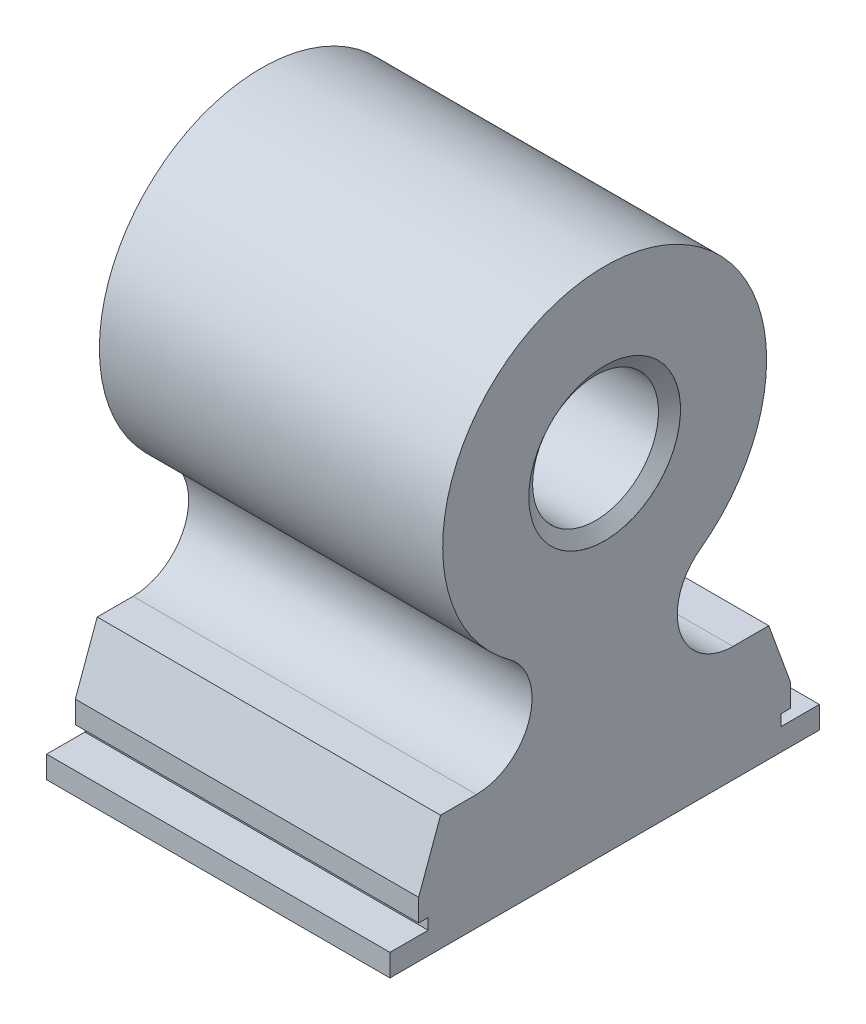
ISO-10303-21;
HEADER;
FILE_DESCRIPTION(('STEP AP214'),'2;1');
FILE_NAME('part.step','',(''),(''),'','','');
FILE_SCHEMA(('AUTOMOTIVE_DESIGN { 1 0 10303 214 1 1 1 1 }'));
ENDSEC;
DATA;
#1=APPLICATION_CONTEXT('core data for automotive mechanical design processes');
#2=APPLICATION_PROTOCOL_DEFINITION('international standard','automotive_design',2000,#1);
#3=PRODUCT_CONTEXT('',#1,'mechanical');
#4=PRODUCT('Part','Part','',(#3));
#5=PRODUCT_RELATED_PRODUCT_CATEGORY('part','',(#4));
#6=PRODUCT_DEFINITION_FORMATION('','',#4);
#7=PRODUCT_DEFINITION_CONTEXT('part definition',#1,'design');
#8=PRODUCT_DEFINITION('design','',#6,#7);
#9=PRODUCT_DEFINITION_SHAPE('','',#8);
#10=(LENGTH_UNIT() NAMED_UNIT(*) SI_UNIT(.MILLI.,.METRE.));
#11=(NAMED_UNIT(*) PLANE_ANGLE_UNIT() SI_UNIT($,.RADIAN.));
#12=(NAMED_UNIT(*) SI_UNIT($,.STERADIAN.) SOLID_ANGLE_UNIT());
#13=UNCERTAINTY_MEASURE_WITH_UNIT(LENGTH_MEASURE(1.E-05),#10,'distance_accuracy_value','');
#14=(GEOMETRIC_REPRESENTATION_CONTEXT(3) GLOBAL_UNCERTAINTY_ASSIGNED_CONTEXT((#13)) GLOBAL_UNIT_ASSIGNED_CONTEXT((#10,
#11,#12)) REPRESENTATION_CONTEXT('',''));
#15=CARTESIAN_POINT('',(0.,0.,0.));
#16=DIRECTION('',(0.,0.,1.));
#17=DIRECTION('',(1.,0.,0.));
#18=AXIS2_PLACEMENT_3D('',#15,#16,#17);
#19=CARTESIAN_POINT('',(9.4234,0.,0.));
#20=DIRECTION('',(-1.,0.,0.));
#21=DIRECTION('',(0.,0.,1.));
#22=AXIS2_PLACEMENT_3D('',#19,#20,#21);
#23=CYLINDRICAL_SURFACE('',#22,1.7272);
#24=CARTESIAN_POINT('',(0.251441318629806,0.,0.));
#25=DIRECTION('',(-1.,0.,0.));
#26=DIRECTION('',(0.,0.,1.));
#27=AXIS2_PLACEMENT_3D('',#24,#25,#26);
#28=CIRCLE('',#27,1.7272);
#29=CARTESIAN_POINT('',(0.251441318629806,0.,1.7272));
#30=VERTEX_POINT('',#29);
#31=EDGE_CURVE('E273',#30,#30,#28,.T.);
#32=ORIENTED_EDGE('',*,*,#31,.T.);
#33=EDGE_LOOP('',(#32));
#34=FACE_BOUND('',#33,.T.);
#35=CARTESIAN_POINT('',(9.17195868137019,0.,0.));
#36=DIRECTION('',(-1.,0.,0.));
#37=DIRECTION('',(0.,0.,1.));
#38=AXIS2_PLACEMENT_3D('',#35,#36,#37);
#39=CIRCLE('',#38,1.7272);
#40=CARTESIAN_POINT('',(9.17195868137019,0.,1.7272));
#41=VERTEX_POINT('',#40);
#42=EDGE_CURVE('E471',#41,#41,#39,.T.);
#43=ORIENTED_EDGE('',*,*,#42,.F.);
#44=EDGE_LOOP('',(#43));
#45=FACE_BOUND('',#44,.T.);
#46=ADVANCED_FACE('F32',(#34,#45),#23,.F.);
#47=CARTESIAN_POINT('',(9.4234,-4.82346177374281,3.52043822625719));
#48=DIRECTION('',(-1.,0.,0.));
#49=DIRECTION('',(0.,0.,1.));
#50=AXIS2_PLACEMENT_3D('',#47,#48,#49);
#51=PLANE('',#50);
#52=DIRECTION('',(0.,-1.,0.));
#53=VECTOR('',#52,1.);
#54=CARTESIAN_POINT('',(9.4234,-9.525,5.8928));
#55=LINE('',#54,#53);
#56=CARTESIAN_POINT('',(9.4234,-8.9154,5.8928));
#57=VERTEX_POINT('',#56);
#58=CARTESIAN_POINT('',(9.4234,-9.525,5.8928));
#59=VERTEX_POINT('',#58);
#60=EDGE_CURVE('E227',#57,#59,#55,.T.);
#61=ORIENTED_EDGE('',*,*,#60,.T.);
#62=DIRECTION('',(0.,0.,-1.));
#63=VECTOR('',#62,1.);
#64=CARTESIAN_POINT('',(9.4234,-9.525,5.8928));
#65=LINE('',#64,#63);
#66=CARTESIAN_POINT('',(9.4234,-9.525,-5.8928));
#67=VERTEX_POINT('',#66);
#68=EDGE_CURVE('E124',#59,#67,#65,.T.);
#69=ORIENTED_EDGE('',*,*,#68,.T.);
#70=DIRECTION('',(0.,1.,0.));
#71=VECTOR('',#70,1.);
#72=CARTESIAN_POINT('',(9.4234,-9.525,-5.8928));
#73=LINE('',#72,#71);
#74=CARTESIAN_POINT('',(9.4234,-8.9154,-5.8928));
#75=VERTEX_POINT('',#74);
#76=EDGE_CURVE('E283',#67,#75,#73,.T.);
#77=ORIENTED_EDGE('',*,*,#76,.T.);
#78=DIRECTION('',(0.,0.,1.));
#79=VECTOR('',#78,1.);
#80=CARTESIAN_POINT('',(9.4234,-8.9154,-5.8928));
#81=LINE('',#80,#79);
#82=CARTESIAN_POINT('',(9.4234,-8.9154,-4.84293333333333));
#83=VERTEX_POINT('',#82);
#84=EDGE_CURVE('E285',#75,#83,#81,.T.);
#85=ORIENTED_EDGE('',*,*,#84,.T.);
#86=DIRECTION('',(0.,1.,0.));
#87=VECTOR('',#86,1.);
#88=CARTESIAN_POINT('',(9.4234,-8.9154,-4.84293333333333));
#89=LINE('',#88,#87);
#90=CARTESIAN_POINT('',(9.4234,-8.6106,-4.84293333333333));
#91=VERTEX_POINT('',#90);
#92=EDGE_CURVE('E287',#83,#91,#89,.T.);
#93=ORIENTED_EDGE('',*,*,#92,.T.);
#94=DIRECTION('',(0.,0.,-1.));
#95=VECTOR('',#94,1.);
#96=CARTESIAN_POINT('',(9.4234,-8.6106,-4.84293333333333));
#97=LINE('',#96,#95);
#98=CARTESIAN_POINT('',(9.4234,-8.6106,-5.1054));
#99=VERTEX_POINT('',#98);
#100=EDGE_CURVE('E289',#91,#99,#97,.T.);
#101=ORIENTED_EDGE('',*,*,#100,.T.);
#102=DIRECTION('',(0.,1.,0.));
#103=VECTOR('',#102,1.);
#104=CARTESIAN_POINT('',(9.4234,-8.001,-5.1054));
#105=LINE('',#104,#103);
#106=CARTESIAN_POINT('',(9.4234,-8.001,-5.1054));
#107=VERTEX_POINT('',#106);
#108=EDGE_CURVE('E291',#99,#107,#105,.T.);
#109=ORIENTED_EDGE('',*,*,#108,.T.);
#110=DIRECTION('',(0.,0.939692620785908,0.34202014332567));
#111=VECTOR('',#110,1.);
#112=CARTESIAN_POINT('',(9.4234,-6.35,-4.5044851432265));
#113=LINE('',#112,#111);
#114=CARTESIAN_POINT('',(9.4234,-6.35,-4.5044851432265));
#115=VERTEX_POINT('',#114);
#116=EDGE_CURVE('E293',#107,#115,#113,.T.);
#117=ORIENTED_EDGE('',*,*,#116,.T.);
#118=DIRECTION('',(0.,0.,1.));
#119=VECTOR('',#118,1.);
#120=CARTESIAN_POINT('',(9.4234,-6.35,-4.5044851432265));
#121=LINE('',#120,#119);
#122=CARTESIAN_POINT('',(9.4234,-6.35,-3.52043822625719));
#123=VERTEX_POINT('',#122);
#124=EDGE_CURVE('E295',#115,#123,#121,.T.);
#125=ORIENTED_EDGE('',*,*,#124,.T.);
#126=CARTESIAN_POINT('',(9.4234,-4.82346177374281,-3.52043822625719));
#127=DIRECTION('',(-1.,0.,0.));
#128=DIRECTION('',(0.,0.,1.));
#129=AXIS2_PLACEMENT_3D('',#126,#127,#128);
#130=CIRCLE('',#129,1.5265382262572);
#131=CARTESIAN_POINT('',(9.4234,-3.59041285041308,-2.62048861161209));
#132=VERTEX_POINT('',#131);
#133=EDGE_CURVE('E297',#123,#132,#130,.T.);
#134=ORIENTED_EDGE('',*,*,#133,.T.);
#135=CARTESIAN_POINT('',(9.4234,0.,0.));
#136=DIRECTION('',(1.,0.,0.));
#137=DIRECTION('',(0.,0.,-1.));
#138=AXIS2_PLACEMENT_3D('',#135,#136,#137);
#139=CIRCLE('',#138,4.445);
#140=CARTESIAN_POINT('',(9.4234,-3.59041285041308,2.62048861161208));
#141=VERTEX_POINT('',#140);
#142=EDGE_CURVE('E299',#132,#141,#139,.T.);
#143=ORIENTED_EDGE('',*,*,#142,.T.);
#144=CARTESIAN_POINT('',(9.4234,-4.82346177374281,3.52043822625719));
#145=DIRECTION('',(-1.,0.,0.));
#146=DIRECTION('',(0.,0.,1.));
#147=AXIS2_PLACEMENT_3D('',#144,#145,#146);
#148=CIRCLE('',#147,1.5265382262572);
#149=CARTESIAN_POINT('',(9.4234,-6.35,3.52043822625719));
#150=VERTEX_POINT('',#149);
#151=EDGE_CURVE('E301',#141,#150,#148,.T.);
#152=ORIENTED_EDGE('',*,*,#151,.T.);
#153=DIRECTION('',(0.,0.,1.));
#154=VECTOR('',#153,1.);
#155=CARTESIAN_POINT('',(9.4234,-6.35,3.52043822625719));
#156=LINE('',#155,#154);
#157=CARTESIAN_POINT('',(9.4234,-6.35,4.5044851432265));
#158=VERTEX_POINT('',#157);
#159=EDGE_CURVE('E303',#150,#158,#156,.T.);
#160=ORIENTED_EDGE('',*,*,#159,.T.);
#161=DIRECTION('',(0.,-0.939692620785908,0.34202014332567));
#162=VECTOR('',#161,1.);
#163=CARTESIAN_POINT('',(9.4234,-6.35,4.5044851432265));
#164=LINE('',#163,#162);
#165=CARTESIAN_POINT('',(9.4234,-8.001,5.1054));
#166=VERTEX_POINT('',#165);
#167=EDGE_CURVE('E305',#158,#166,#164,.T.);
#168=ORIENTED_EDGE('',*,*,#167,.T.);
#169=DIRECTION('',(0.,-1.,0.));
#170=VECTOR('',#169,1.);
#171=CARTESIAN_POINT('',(9.4234,-8.001,5.1054));
#172=LINE('',#171,#170);
#173=CARTESIAN_POINT('',(9.4234,-8.6106,5.1054));
#174=VERTEX_POINT('',#173);
#175=EDGE_CURVE('E174',#166,#174,#172,.T.);
#176=ORIENTED_EDGE('',*,*,#175,.T.);
#177=DIRECTION('',(0.,0.,-1.));
#178=VECTOR('',#177,1.);
#179=CARTESIAN_POINT('',(9.4234,-8.6106,4.84293333333333));
#180=LINE('',#179,#178);
#181=CARTESIAN_POINT('',(9.4234,-8.6106,4.84293333333333));
#182=VERTEX_POINT('',#181);
#183=EDGE_CURVE('E167',#174,#182,#180,.T.);
#184=ORIENTED_EDGE('',*,*,#183,.T.);
#185=DIRECTION('',(0.,-1.,0.));
#186=VECTOR('',#185,1.);
#187=CARTESIAN_POINT('',(9.4234,-8.9154,4.84293333333333));
#188=LINE('',#187,#186);
#189=CARTESIAN_POINT('',(9.4234,-8.9154,4.84293333333333));
#190=VERTEX_POINT('',#189);
#191=EDGE_CURVE('E172',#182,#190,#188,.T.);
#192=ORIENTED_EDGE('',*,*,#191,.T.);
#193=DIRECTION('',(0.,0.,1.));
#194=VECTOR('',#193,1.);
#195=CARTESIAN_POINT('',(9.4234,-8.9154,5.8928));
#196=LINE('',#195,#194);
#197=EDGE_CURVE('E51',#190,#57,#196,.T.);
#198=ORIENTED_EDGE('',*,*,#197,.T.);
#199=EDGE_LOOP('',(#61,#69,#77,#85,#93,#101,#109,#117,#125,#134,#143,#152,#160,#168,#176,#184,
#192,#198));
#200=FACE_BOUND('',#199,.T.);
#201=CARTESIAN_POINT('',(9.4234,0.,0.));
#202=DIRECTION('',(-1.,0.,0.));
#203=DIRECTION('',(0.,0.,1.));
#204=AXIS2_PLACEMENT_3D('',#201,#202,#203);
#205=CIRCLE('',#204,2.0828);
#206=CARTESIAN_POINT('',(9.4234,0.,2.0828));
#207=VERTEX_POINT('',#206);
#208=EDGE_CURVE('E36',#207,#207,#205,.F.);
#209=ORIENTED_EDGE('',*,*,#208,.F.);
#210=EDGE_LOOP('',(#209));
#211=FACE_BOUND('',#210,.T.);
#212=ADVANCED_FACE('F169',(#200,#211),#51,.F.);
#213=CARTESIAN_POINT('',(0.,-4.82346177374281,3.52043822625719));
#214=DIRECTION('',(-1.,0.,0.));
#215=DIRECTION('',(0.,0.,1.));
#216=AXIS2_PLACEMENT_3D('',#213,#214,#215);
#217=PLANE('',#216);
#218=DIRECTION('',(0.,-1.,0.));
#219=VECTOR('',#218,1.);
#220=CARTESIAN_POINT('',(0.,-9.525,5.8928));
#221=LINE('',#220,#219);
#222=CARTESIAN_POINT('',(0.,-8.9154,5.8928));
#223=VERTEX_POINT('',#222);
#224=CARTESIAN_POINT('',(0.,-9.525,5.8928));
#225=VERTEX_POINT('',#224);
#226=EDGE_CURVE('E192',#223,#225,#221,.T.);
#227=ORIENTED_EDGE('',*,*,#226,.F.);
#228=DIRECTION('',(0.,0.,1.));
#229=VECTOR('',#228,1.);
#230=CARTESIAN_POINT('',(0.,-8.9154,5.8928));
#231=LINE('',#230,#229);
#232=CARTESIAN_POINT('',(0.,-8.9154,4.84293333333333));
#233=VERTEX_POINT('',#232);
#234=EDGE_CURVE('E116',#233,#223,#231,.T.);
#235=ORIENTED_EDGE('',*,*,#234,.F.);
#236=DIRECTION('',(0.,-1.,0.));
#237=VECTOR('',#236,1.);
#238=CARTESIAN_POINT('',(0.,-8.9154,4.84293333333333));
#239=LINE('',#238,#237);
#240=CARTESIAN_POINT('',(0.,-8.6106,4.84293333333333));
#241=VERTEX_POINT('',#240);
#242=EDGE_CURVE('E110',#241,#233,#239,.T.);
#243=ORIENTED_EDGE('',*,*,#242,.F.);
#244=DIRECTION('',(0.,0.,-1.));
#245=VECTOR('',#244,1.);
#246=CARTESIAN_POINT('',(0.,-8.6106,4.84293333333333));
#247=LINE('',#246,#245);
#248=CARTESIAN_POINT('',(0.,-8.6106,5.1054));
#249=VERTEX_POINT('',#248);
#250=EDGE_CURVE('E182',#249,#241,#247,.T.);
#251=ORIENTED_EDGE('',*,*,#250,.F.);
#252=DIRECTION('',(0.,-1.,0.));
#253=VECTOR('',#252,1.);
#254=CARTESIAN_POINT('',(0.,-8.001,5.1054));
#255=LINE('',#254,#253);
#256=CARTESIAN_POINT('',(0.,-8.001,5.1054));
#257=VERTEX_POINT('',#256);
#258=EDGE_CURVE('E222',#257,#249,#255,.T.);
#259=ORIENTED_EDGE('',*,*,#258,.F.);
#260=DIRECTION('',(0.,-0.939692620785908,0.34202014332567));
#261=VECTOR('',#260,1.);
#262=CARTESIAN_POINT('',(0.,-6.35,4.5044851432265));
#263=LINE('',#262,#261);
#264=CARTESIAN_POINT('',(0.,-6.35,4.5044851432265));
#265=VERTEX_POINT('',#264);
#266=EDGE_CURVE('E220',#265,#257,#263,.T.);
#267=ORIENTED_EDGE('',*,*,#266,.F.);
#268=DIRECTION('',(0.,0.,1.));
#269=VECTOR('',#268,1.);
#270=CARTESIAN_POINT('',(0.,-6.35,3.52043822625719));
#271=LINE('',#270,#269);
#272=CARTESIAN_POINT('',(0.,-6.35,3.52043822625719));
#273=VERTEX_POINT('',#272);
#274=EDGE_CURVE('E218',#273,#265,#271,.T.);
#275=ORIENTED_EDGE('',*,*,#274,.F.);
#276=CARTESIAN_POINT('',(0.,-4.82346177374281,3.52043822625719));
#277=DIRECTION('',(-1.,0.,0.));
#278=DIRECTION('',(0.,0.,1.));
#279=AXIS2_PLACEMENT_3D('',#276,#277,#278);
#280=CIRCLE('',#279,1.5265382262572);
#281=CARTESIAN_POINT('',(0.,-3.59041285041308,2.62048861161208));
#282=VERTEX_POINT('',#281);
#283=EDGE_CURVE('E216',#282,#273,#280,.T.);
#284=ORIENTED_EDGE('',*,*,#283,.F.);
#285=CARTESIAN_POINT('',(0.,0.,0.));
#286=DIRECTION('',(1.,0.,0.));
#287=DIRECTION('',(0.,0.,-1.));
#288=AXIS2_PLACEMENT_3D('',#285,#286,#287);
#289=CIRCLE('',#288,4.445);
#290=CARTESIAN_POINT('',(0.,-3.59041285041308,-2.62048861161209));
#291=VERTEX_POINT('',#290);
#292=EDGE_CURVE('E214',#291,#282,#289,.T.);
#293=ORIENTED_EDGE('',*,*,#292,.F.);
#294=CARTESIAN_POINT('',(0.,-4.82346177374281,-3.52043822625719));
#295=DIRECTION('',(-1.,0.,0.));
#296=DIRECTION('',(0.,0.,1.));
#297=AXIS2_PLACEMENT_3D('',#294,#295,#296);
#298=CIRCLE('',#297,1.5265382262572);
#299=CARTESIAN_POINT('',(0.,-6.35,-3.52043822625719));
#300=VERTEX_POINT('',#299);
#301=EDGE_CURVE('E212',#300,#291,#298,.T.);
#302=ORIENTED_EDGE('',*,*,#301,.F.);
#303=DIRECTION('',(0.,0.,1.));
#304=VECTOR('',#303,1.);
#305=CARTESIAN_POINT('',(0.,-6.35,-4.5044851432265));
#306=LINE('',#305,#304);
#307=CARTESIAN_POINT('',(0.,-6.35,-4.5044851432265));
#308=VERTEX_POINT('',#307);
#309=EDGE_CURVE('E210',#308,#300,#306,.T.);
#310=ORIENTED_EDGE('',*,*,#309,.F.);
#311=DIRECTION('',(0.,0.939692620785908,0.34202014332567));
#312=VECTOR('',#311,1.);
#313=CARTESIAN_POINT('',(0.,-6.35,-4.5044851432265));
#314=LINE('',#313,#312);
#315=CARTESIAN_POINT('',(0.,-8.001,-5.1054));
#316=VERTEX_POINT('',#315);
#317=EDGE_CURVE('E208',#316,#308,#314,.T.);
#318=ORIENTED_EDGE('',*,*,#317,.F.);
#319=DIRECTION('',(0.,1.,0.));
#320=VECTOR('',#319,1.);
#321=CARTESIAN_POINT('',(0.,-8.001,-5.1054));
#322=LINE('',#321,#320);
#323=CARTESIAN_POINT('',(0.,-8.6106,-5.1054));
#324=VERTEX_POINT('',#323);
#325=EDGE_CURVE('E206',#324,#316,#322,.T.);
#326=ORIENTED_EDGE('',*,*,#325,.F.);
#327=DIRECTION('',(0.,0.,-1.));
#328=VECTOR('',#327,1.);
#329=CARTESIAN_POINT('',(0.,-8.6106,-4.84293333333333));
#330=LINE('',#329,#328);
#331=CARTESIAN_POINT('',(0.,-8.6106,-4.84293333333333));
#332=VERTEX_POINT('',#331);
#333=EDGE_CURVE('E204',#332,#324,#330,.T.);
#334=ORIENTED_EDGE('',*,*,#333,.F.);
#335=DIRECTION('',(0.,1.,0.));
#336=VECTOR('',#335,1.);
#337=CARTESIAN_POINT('',(0.,-8.9154,-4.84293333333333));
#338=LINE('',#337,#336);
#339=CARTESIAN_POINT('',(0.,-8.9154,-4.84293333333333));
#340=VERTEX_POINT('',#339);
#341=EDGE_CURVE('E202',#340,#332,#338,.T.);
#342=ORIENTED_EDGE('',*,*,#341,.F.);
#343=DIRECTION('',(0.,0.,1.));
#344=VECTOR('',#343,1.);
#345=CARTESIAN_POINT('',(0.,-8.9154,-5.8928));
#346=LINE('',#345,#344);
#347=CARTESIAN_POINT('',(0.,-8.9154,-5.8928));
#348=VERTEX_POINT('',#347);
#349=EDGE_CURVE('E200',#348,#340,#346,.T.);
#350=ORIENTED_EDGE('',*,*,#349,.F.);
#351=DIRECTION('',(0.,1.,0.));
#352=VECTOR('',#351,1.);
#353=CARTESIAN_POINT('',(0.,-9.525,-5.8928));
#354=LINE('',#353,#352);
#355=CARTESIAN_POINT('',(0.,-9.525,-5.8928));
#356=VERTEX_POINT('',#355);
#357=EDGE_CURVE('E198',#356,#348,#354,.T.);
#358=ORIENTED_EDGE('',*,*,#357,.F.);
#359=DIRECTION('',(0.,0.,-1.));
#360=VECTOR('',#359,1.);
#361=CARTESIAN_POINT('',(0.,-9.525,5.8928));
#362=LINE('',#361,#360);
#363=EDGE_CURVE('E195',#225,#356,#362,.T.);
#364=ORIENTED_EDGE('',*,*,#363,.F.);
#365=EDGE_LOOP('',(#227,#235,#243,#251,#259,#267,#275,#284,#293,#302,#310,#318,#326,#334,#342,
#350,#358,#364));
#366=FACE_BOUND('',#365,.T.);
#367=CARTESIAN_POINT('',(0.,0.,0.));
#368=DIRECTION('',(-1.,0.,0.));
#369=DIRECTION('',(0.,0.,1.));
#370=AXIS2_PLACEMENT_3D('',#367,#368,#369);
#371=CIRCLE('',#370,2.0828);
#372=CARTESIAN_POINT('',(0.,0.,2.0828));
#373=VERTEX_POINT('',#372);
#374=EDGE_CURVE('E196',#373,#373,#371,.F.);
#375=ORIENTED_EDGE('',*,*,#374,.T.);
#376=EDGE_LOOP('',(#375));
#377=FACE_BOUND('',#376,.T.);
#378=ADVANCED_FACE('F318',(#366,#377),#217,.T.);
#379=CARTESIAN_POINT('',(9.4234,-9.525,5.8928));
#380=DIRECTION('',(0.,0.,-1.));
#381=DIRECTION('',(-1.,0.,0.));
#382=AXIS2_PLACEMENT_3D('',#379,#380,#381);
#383=PLANE('',#382);
#384=ORIENTED_EDGE('',*,*,#226,.T.);
#385=DIRECTION('',(-1.,0.,0.));
#386=VECTOR('',#385,1.);
#387=CARTESIAN_POINT('',(9.4234,-9.525,5.8928));
#388=LINE('',#387,#386);
#389=EDGE_CURVE('E11',#59,#225,#388,.T.);
#390=ORIENTED_EDGE('',*,*,#389,.F.);
#391=ORIENTED_EDGE('',*,*,#60,.F.);
#392=DIRECTION('',(-1.,0.,0.));
#393=VECTOR('',#392,1.);
#394=CARTESIAN_POINT('',(9.4234,-8.9154,5.8928));
#395=LINE('',#394,#393);
#396=EDGE_CURVE('E188',#57,#223,#395,.T.);
#397=ORIENTED_EDGE('',*,*,#396,.T.);
#398=EDGE_LOOP('',(#384,#390,#391,#397));
#399=FACE_BOUND('',#398,.T.);
#400=ADVANCED_FACE('F34',(#399),#383,.F.);
#401=CARTESIAN_POINT('',(9.4234,-9.525,5.8928));
#402=DIRECTION('',(0.,1.,0.));
#403=DIRECTION('',(0.,0.,1.));
#404=AXIS2_PLACEMENT_3D('',#401,#402,#403);
#405=PLANE('',#404);
#406=ORIENTED_EDGE('',*,*,#363,.T.);
#407=DIRECTION('',(-1.,0.,0.));
#408=VECTOR('',#407,1.);
#409=CARTESIAN_POINT('',(9.4234,-9.525,-5.8928));
#410=LINE('',#409,#408);
#411=EDGE_CURVE('E42',#67,#356,#410,.T.);
#412=ORIENTED_EDGE('',*,*,#411,.F.);
#413=ORIENTED_EDGE('',*,*,#68,.F.);
#414=ORIENTED_EDGE('',*,*,#389,.T.);
#415=EDGE_LOOP('',(#406,#412,#413,#414));
#416=FACE_BOUND('',#415,.T.);
#417=ADVANCED_FACE('F348',(#416),#405,.F.);
#418=CARTESIAN_POINT('',(9.4234,-9.525,-5.8928));
#419=DIRECTION('',(0.,0.,1.));
#420=DIRECTION('',(1.,0.,0.));
#421=AXIS2_PLACEMENT_3D('',#418,#419,#420);
#422=PLANE('',#421);
#423=ORIENTED_EDGE('',*,*,#357,.T.);
#424=DIRECTION('',(-1.,0.,0.));
#425=VECTOR('',#424,1.);
#426=CARTESIAN_POINT('',(9.4234,-8.9154,-5.8928));
#427=LINE('',#426,#425);
#428=EDGE_CURVE('E264',#75,#348,#427,.T.);
#429=ORIENTED_EDGE('',*,*,#428,.F.);
#430=ORIENTED_EDGE('',*,*,#76,.F.);
#431=ORIENTED_EDGE('',*,*,#411,.T.);
#432=EDGE_LOOP('',(#423,#429,#430,#431));
#433=FACE_BOUND('',#432,.T.);
#434=ADVANCED_FACE('F352',(#433),#422,.F.);
#435=CARTESIAN_POINT('',(9.4234,-8.9154,-5.8928));
#436=DIRECTION('',(0.,-1.,0.));
#437=DIRECTION('',(0.,0.,-1.));
#438=AXIS2_PLACEMENT_3D('',#435,#436,#437);
#439=PLANE('',#438);
#440=ORIENTED_EDGE('',*,*,#349,.T.);
#441=DIRECTION('',(-1.,0.,0.));
#442=VECTOR('',#441,1.);
#443=CARTESIAN_POINT('',(9.4234,-8.9154,-4.84293333333333));
#444=LINE('',#443,#442);
#445=EDGE_CURVE('E261',#83,#340,#444,.T.);
#446=ORIENTED_EDGE('',*,*,#445,.F.);
#447=ORIENTED_EDGE('',*,*,#84,.F.);
#448=ORIENTED_EDGE('',*,*,#428,.T.);
#449=EDGE_LOOP('',(#440,#446,#447,#448));
#450=FACE_BOUND('',#449,.T.);
#451=ADVANCED_FACE('F356',(#450),#439,.F.);
#452=CARTESIAN_POINT('',(9.4234,-8.9154,-4.84293333333333));
#453=DIRECTION('',(0.,0.,1.));
#454=DIRECTION('',(1.,0.,0.));
#455=AXIS2_PLACEMENT_3D('',#452,#453,#454);
#456=PLANE('',#455);
#457=ORIENTED_EDGE('',*,*,#341,.T.);
#458=DIRECTION('',(-1.,0.,0.));
#459=VECTOR('',#458,1.);
#460=CARTESIAN_POINT('',(9.4234,-8.6106,-4.84293333333333));
#461=LINE('',#460,#459);
#462=EDGE_CURVE('E258',#91,#332,#461,.T.);
#463=ORIENTED_EDGE('',*,*,#462,.F.);
#464=ORIENTED_EDGE('',*,*,#92,.F.);
#465=ORIENTED_EDGE('',*,*,#445,.T.);
#466=EDGE_LOOP('',(#457,#463,#464,#465));
#467=FACE_BOUND('',#466,.T.);
#468=ADVANCED_FACE('F362',(#467),#456,.F.);
#469=CARTESIAN_POINT('',(9.4234,-8.6106,-4.84293333333333));
#470=DIRECTION('',(0.,1.,0.));
#471=DIRECTION('',(0.,0.,1.));
#472=AXIS2_PLACEMENT_3D('',#469,#470,#471);
#473=PLANE('',#472);
#474=ORIENTED_EDGE('',*,*,#333,.T.);
#475=DIRECTION('',(-1.,0.,0.));
#476=VECTOR('',#475,1.);
#477=CARTESIAN_POINT('',(9.4234,-8.6106,-5.1054));
#478=LINE('',#477,#476);
#479=EDGE_CURVE('E255',#99,#324,#478,.T.);
#480=ORIENTED_EDGE('',*,*,#479,.F.);
#481=ORIENTED_EDGE('',*,*,#100,.F.);
#482=ORIENTED_EDGE('',*,*,#462,.T.);
#483=EDGE_LOOP('',(#474,#480,#481,#482));
#484=FACE_BOUND('',#483,.T.);
#485=ADVANCED_FACE('F366',(#484),#473,.F.);
#486=CARTESIAN_POINT('',(9.4234,-8.001,-5.1054));
#487=DIRECTION('',(0.,0.,1.));
#488=DIRECTION('',(1.,0.,0.));
#489=AXIS2_PLACEMENT_3D('',#486,#487,#488);
#490=PLANE('',#489);
#491=ORIENTED_EDGE('',*,*,#325,.T.);
#492=DIRECTION('',(-1.,0.,0.));
#493=VECTOR('',#492,1.);
#494=CARTESIAN_POINT('',(9.4234,-8.001,-5.1054));
#495=LINE('',#494,#493);
#496=EDGE_CURVE('E252',#107,#316,#495,.T.);
#497=ORIENTED_EDGE('',*,*,#496,.F.);
#498=ORIENTED_EDGE('',*,*,#108,.F.);
#499=ORIENTED_EDGE('',*,*,#479,.T.);
#500=EDGE_LOOP('',(#491,#497,#498,#499));
#501=FACE_BOUND('',#500,.T.);
#502=ADVANCED_FACE('F370',(#501),#490,.F.);
#503=CARTESIAN_POINT('',(9.4234,-6.35,-4.5044851432265));
#504=DIRECTION('',(0.,-0.34202014332567,0.939692620785908));
#505=DIRECTION('',(0.,-0.939692620785908,-0.34202014332567));
#506=AXIS2_PLACEMENT_3D('',#503,#504,#505);
#507=PLANE('',#506);
#508=ORIENTED_EDGE('',*,*,#317,.T.);
#509=DIRECTION('',(-1.,0.,0.));
#510=VECTOR('',#509,1.);
#511=CARTESIAN_POINT('',(9.4234,-6.35,-4.5044851432265));
#512=LINE('',#511,#510);
#513=EDGE_CURVE('E249',#115,#308,#512,.T.);
#514=ORIENTED_EDGE('',*,*,#513,.F.);
#515=ORIENTED_EDGE('',*,*,#116,.F.);
#516=ORIENTED_EDGE('',*,*,#496,.T.);
#517=EDGE_LOOP('',(#508,#514,#515,#516));
#518=FACE_BOUND('',#517,.T.);
#519=ADVANCED_FACE('F374',(#518),#507,.F.);
#520=CARTESIAN_POINT('',(9.4234,-6.35,-4.5044851432265));
#521=DIRECTION('',(0.,-1.,0.));
#522=DIRECTION('',(0.,0.,-1.));
#523=AXIS2_PLACEMENT_3D('',#520,#521,#522);
#524=PLANE('',#523);
#525=ORIENTED_EDGE('',*,*,#309,.T.);
#526=DIRECTION('',(-1.,0.,0.));
#527=VECTOR('',#526,1.);
#528=CARTESIAN_POINT('',(9.4234,-6.35,-3.52043822625719));
#529=LINE('',#528,#527);
#530=EDGE_CURVE('E246',#123,#300,#529,.T.);
#531=ORIENTED_EDGE('',*,*,#530,.F.);
#532=ORIENTED_EDGE('',*,*,#124,.F.);
#533=ORIENTED_EDGE('',*,*,#513,.T.);
#534=EDGE_LOOP('',(#525,#531,#532,#533));
#535=FACE_BOUND('',#534,.T.);
#536=ADVANCED_FACE('F378',(#535),#524,.F.);
#537=CARTESIAN_POINT('',(9.4234,-4.82346177374281,-3.52043822625719));
#538=DIRECTION('',(-1.,0.,0.));
#539=DIRECTION('',(0.,0.,1.));
#540=AXIS2_PLACEMENT_3D('',#537,#538,#539);
#541=CYLINDRICAL_SURFACE('',#540,1.5265382262572);
#542=ORIENTED_EDGE('',*,*,#301,.T.);
#543=DIRECTION('',(-1.,0.,0.));
#544=VECTOR('',#543,1.);
#545=CARTESIAN_POINT('',(9.4234,-3.59041285041308,-2.62048861161209));
#546=LINE('',#545,#544);
#547=EDGE_CURVE('E243',#132,#291,#546,.T.);
#548=ORIENTED_EDGE('',*,*,#547,.F.);
#549=ORIENTED_EDGE('',*,*,#133,.F.);
#550=ORIENTED_EDGE('',*,*,#530,.T.);
#551=EDGE_LOOP('',(#542,#548,#549,#550));
#552=FACE_BOUND('',#551,.T.);
#553=ADVANCED_FACE('F382',(#552),#541,.F.);
#554=CARTESIAN_POINT('',(9.4234,0.,0.));
#555=DIRECTION('',(-1.,0.,0.));
#556=DIRECTION('',(0.,0.,1.));
#557=AXIS2_PLACEMENT_3D('',#554,#555,#556);
#558=CYLINDRICAL_SURFACE('',#557,4.445);
#559=ORIENTED_EDGE('',*,*,#292,.T.);
#560=DIRECTION('',(-1.,0.,0.));
#561=VECTOR('',#560,1.);
#562=CARTESIAN_POINT('',(9.4234,-3.59041285041308,2.62048861161208));
#563=LINE('',#562,#561);
#564=EDGE_CURVE('E240',#141,#282,#563,.T.);
#565=ORIENTED_EDGE('',*,*,#564,.F.);
#566=ORIENTED_EDGE('',*,*,#142,.F.);
#567=ORIENTED_EDGE('',*,*,#547,.T.);
#568=EDGE_LOOP('',(#559,#565,#566,#567));
#569=FACE_BOUND('',#568,.T.);
#570=ADVANCED_FACE('F386',(#569),#558,.T.);
#571=CARTESIAN_POINT('',(9.4234,-4.82346177374281,3.52043822625719));
#572=DIRECTION('',(-1.,0.,0.));
#573=DIRECTION('',(0.,0.,1.));
#574=AXIS2_PLACEMENT_3D('',#571,#572,#573);
#575=CYLINDRICAL_SURFACE('',#574,1.5265382262572);
#576=ORIENTED_EDGE('',*,*,#283,.T.);
#577=DIRECTION('',(-1.,0.,0.));
#578=VECTOR('',#577,1.);
#579=CARTESIAN_POINT('',(9.4234,-6.35,3.52043822625719));
#580=LINE('',#579,#578);
#581=EDGE_CURVE('E237',#150,#273,#580,.T.);
#582=ORIENTED_EDGE('',*,*,#581,.F.);
#583=ORIENTED_EDGE('',*,*,#151,.F.);
#584=ORIENTED_EDGE('',*,*,#564,.T.);
#585=EDGE_LOOP('',(#576,#582,#583,#584));
#586=FACE_BOUND('',#585,.T.);
#587=ADVANCED_FACE('F390',(#586),#575,.F.);
#588=CARTESIAN_POINT('',(9.4234,-6.35,3.52043822625719));
#589=DIRECTION('',(0.,-1.,0.));
#590=DIRECTION('',(0.,0.,-1.));
#591=AXIS2_PLACEMENT_3D('',#588,#589,#590);
#592=PLANE('',#591);
#593=ORIENTED_EDGE('',*,*,#274,.T.);
#594=DIRECTION('',(-1.,0.,0.));
#595=VECTOR('',#594,1.);
#596=CARTESIAN_POINT('',(9.4234,-6.35,4.5044851432265));
#597=LINE('',#596,#595);
#598=EDGE_CURVE('E234',#158,#265,#597,.T.);
#599=ORIENTED_EDGE('',*,*,#598,.F.);
#600=ORIENTED_EDGE('',*,*,#159,.F.);
#601=ORIENTED_EDGE('',*,*,#581,.T.);
#602=EDGE_LOOP('',(#593,#599,#600,#601));
#603=FACE_BOUND('',#602,.T.);
#604=ADVANCED_FACE('F394',(#603),#592,.F.);
#605=CARTESIAN_POINT('',(9.4234,-6.35,4.5044851432265));
#606=DIRECTION('',(0.,-0.34202014332567,-0.939692620785908));
#607=DIRECTION('',(0.,0.939692620785908,-0.34202014332567));
#608=AXIS2_PLACEMENT_3D('',#605,#606,#607);
#609=PLANE('',#608);
#610=ORIENTED_EDGE('',*,*,#266,.T.);
#611=DIRECTION('',(-1.,0.,0.));
#612=VECTOR('',#611,1.);
#613=CARTESIAN_POINT('',(9.4234,-8.001,5.1054));
#614=LINE('',#613,#612);
#615=EDGE_CURVE('E231',#166,#257,#614,.T.);
#616=ORIENTED_EDGE('',*,*,#615,.F.);
#617=ORIENTED_EDGE('',*,*,#167,.F.);
#618=ORIENTED_EDGE('',*,*,#598,.T.);
#619=EDGE_LOOP('',(#610,#616,#617,#618));
#620=FACE_BOUND('',#619,.T.);
#621=ADVANCED_FACE('F311',(#620),#609,.F.);
#622=CARTESIAN_POINT('',(9.4234,-8.001,5.1054));
#623=DIRECTION('',(0.,0.,-1.));
#624=DIRECTION('',(-1.,0.,0.));
#625=AXIS2_PLACEMENT_3D('',#622,#623,#624);
#626=PLANE('',#625);
#627=ORIENTED_EDGE('',*,*,#258,.T.);
#628=DIRECTION('',(-1.,0.,0.));
#629=VECTOR('',#628,1.);
#630=CARTESIAN_POINT('',(9.4234,-8.6106,5.1054));
#631=LINE('',#630,#629);
#632=EDGE_CURVE('E183',#174,#249,#631,.T.);
#633=ORIENTED_EDGE('',*,*,#632,.F.);
#634=ORIENTED_EDGE('',*,*,#175,.F.);
#635=ORIENTED_EDGE('',*,*,#615,.T.);
#636=EDGE_LOOP('',(#627,#633,#634,#635));
#637=FACE_BOUND('',#636,.T.);
#638=ADVANCED_FACE('F315',(#637),#626,.F.);
#639=CARTESIAN_POINT('',(9.4234,-8.6106,4.84293333333333));
#640=DIRECTION('',(0.,1.,0.));
#641=DIRECTION('',(0.,0.,1.));
#642=AXIS2_PLACEMENT_3D('',#639,#640,#641);
#643=PLANE('',#642);
#644=ORIENTED_EDGE('',*,*,#250,.T.);
#645=DIRECTION('',(-1.,0.,0.));
#646=VECTOR('',#645,1.);
#647=CARTESIAN_POINT('',(9.4234,-8.6106,4.84293333333333));
#648=LINE('',#647,#646);
#649=EDGE_CURVE('E179',#182,#241,#648,.T.);
#650=ORIENTED_EDGE('',*,*,#649,.F.);
#651=ORIENTED_EDGE('',*,*,#183,.F.);
#652=ORIENTED_EDGE('',*,*,#632,.T.);
#653=EDGE_LOOP('',(#644,#650,#651,#652));
#654=FACE_BOUND('',#653,.T.);
#655=ADVANCED_FACE('F180',(#654),#643,.F.);
#656=CARTESIAN_POINT('',(9.4234,-8.9154,4.84293333333333));
#657=DIRECTION('',(0.,0.,-1.));
#658=DIRECTION('',(-1.,0.,0.));
#659=AXIS2_PLACEMENT_3D('',#656,#657,#658);
#660=PLANE('',#659);
#661=ORIENTED_EDGE('',*,*,#242,.T.);
#662=DIRECTION('',(-1.,0.,0.));
#663=VECTOR('',#662,1.);
#664=CARTESIAN_POINT('',(9.4234,-8.9154,4.84293333333333));
#665=LINE('',#664,#663);
#666=EDGE_CURVE('E184',#190,#233,#665,.T.);
#667=ORIENTED_EDGE('',*,*,#666,.F.);
#668=ORIENTED_EDGE('',*,*,#191,.F.);
#669=ORIENTED_EDGE('',*,*,#649,.T.);
#670=EDGE_LOOP('',(#661,#667,#668,#669));
#671=FACE_BOUND('',#670,.T.);
#672=ADVANCED_FACE('F186',(#671),#660,.F.);
#673=CARTESIAN_POINT('',(9.4234,-8.9154,5.8928));
#674=DIRECTION('',(0.,-1.,0.));
#675=DIRECTION('',(0.,0.,-1.));
#676=AXIS2_PLACEMENT_3D('',#673,#674,#675);
#677=PLANE('',#676);
#678=ORIENTED_EDGE('',*,*,#234,.T.);
#679=ORIENTED_EDGE('',*,*,#396,.F.);
#680=ORIENTED_EDGE('',*,*,#197,.F.);
#681=ORIENTED_EDGE('',*,*,#666,.T.);
#682=EDGE_LOOP('',(#678,#679,#680,#681));
#683=FACE_BOUND('',#682,.T.);
#684=ADVANCED_FACE('F323',(#683),#677,.F.);
#685=CARTESIAN_POINT('',(0.251441318629806,0.,0.));
#686=DIRECTION('',(-1.,0.,0.));
#687=DIRECTION('',(0.,0.,1.));
#688=AXIS2_PLACEMENT_3D('',#685,#686,#687);
#689=CONICAL_SURFACE('',#688,1.7272,0.960105621522086);
#690=CARTESIAN_POINT('',(0.00254000000000053,0.,0.));
#691=DIRECTION('',(-1.,0.,0.));
#692=DIRECTION('',(0.,0.,1.));
#693=AXIS2_PLACEMENT_3D('',#690,#691,#692);
#694=CIRCLE('',#693,2.0828);
#695=CARTESIAN_POINT('',(0.00254000000000053,0.,2.0828));
#696=VERTEX_POINT('',#695);
#697=EDGE_CURVE('E269',#696,#696,#694,.T.);
#698=ORIENTED_EDGE('',*,*,#697,.T.);
#699=EDGE_LOOP('',(#698));
#700=FACE_BOUND('',#699,.T.);
#701=ORIENTED_EDGE('',*,*,#31,.F.);
#702=EDGE_LOOP('',(#701));
#703=FACE_BOUND('',#702,.T.);
#704=ADVANCED_FACE('F325',(#700,#703),#689,.F.);
#705=CARTESIAN_POINT('',(-5.10587962441342,0.,0.));
#706=DIRECTION('',(-1.,0.,0.));
#707=DIRECTION('',(0.,0.,1.));
#708=AXIS2_PLACEMENT_3D('',#705,#706,#707);
#709=CYLINDRICAL_SURFACE('',#708,2.0828);
#710=ORIENTED_EDGE('',*,*,#374,.F.);
#711=EDGE_LOOP('',(#710));
#712=FACE_BOUND('',#711,.T.);
#713=ORIENTED_EDGE('',*,*,#697,.F.);
#714=EDGE_LOOP('',(#713));
#715=FACE_BOUND('',#714,.T.);
#716=ADVANCED_FACE('F331',(#712,#715),#709,.F.);
#717=CARTESIAN_POINT('',(-5.10587962441342,0.,0.));
#718=DIRECTION('',(-1.,0.,0.));
#719=DIRECTION('',(0.,0.,1.));
#720=AXIS2_PLACEMENT_3D('',#717,#718,#719);
#721=CYLINDRICAL_SURFACE('',#720,2.0828);
#722=CARTESIAN_POINT('',(9.42086,0.,0.));
#723=DIRECTION('',(-1.,0.,0.));
#724=DIRECTION('',(0.,0.,1.));
#725=AXIS2_PLACEMENT_3D('',#722,#723,#724);
#726=CIRCLE('',#725,2.0828);
#727=CARTESIAN_POINT('',(9.42086,0.,2.0828));
#728=VERTEX_POINT('',#727);
#729=EDGE_CURVE('E474',#728,#728,#726,.T.);
#730=ORIENTED_EDGE('',*,*,#729,.T.);
#731=EDGE_LOOP('',(#730));
#732=FACE_BOUND('',#731,.T.);
#733=ORIENTED_EDGE('',*,*,#208,.T.);
#734=EDGE_LOOP('',(#733));
#735=FACE_BOUND('',#734,.T.);
#736=ADVANCED_FACE('F445',(#732,#735),#721,.F.);
#737=CARTESIAN_POINT('',(9.42086,0.,0.));
#738=DIRECTION('',(1.,0.,0.));
#739=DIRECTION('',(0.,0.,-1.));
#740=AXIS2_PLACEMENT_3D('',#737,#738,#739);
#741=CONICAL_SURFACE('',#740,2.0828,0.960105621522089);
#742=ORIENTED_EDGE('',*,*,#42,.T.);
#743=EDGE_LOOP('',(#742));
#744=FACE_BOUND('',#743,.T.);
#745=ORIENTED_EDGE('',*,*,#729,.F.);
#746=EDGE_LOOP('',(#745));
#747=FACE_BOUND('',#746,.T.);
#748=ADVANCED_FACE('F454',(#744,#747),#741,.F.);
#749=CLOSED_SHELL('',(#46,#212,#378,#400,#417,#434,#451,#468,#485,#502,#519,#536,#553,#570,#587,
#604,#621,#638,#655,#672,#684,#704,#716,#736,#748));
#750=MANIFOLD_SOLID_BREP('B2',#749);
#751=ADVANCED_BREP_SHAPE_REPRESENTATION('',(#18,#750),#14);
#752=SHAPE_DEFINITION_REPRESENTATION(#9,#751);
ENDSEC;
END-ISO-10303-21;
